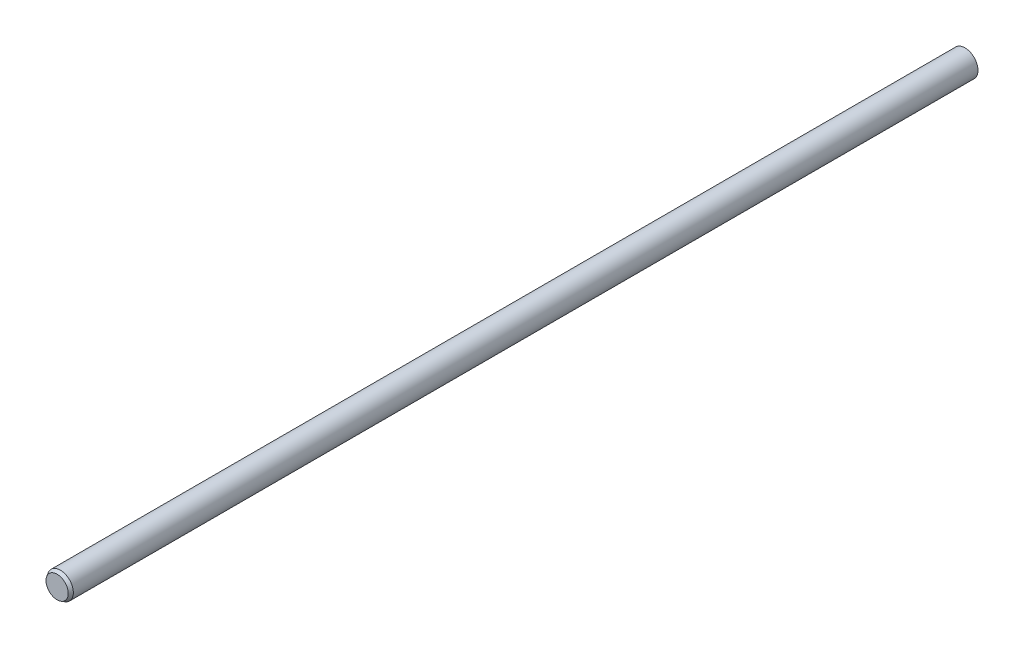
ISO-10303-21;
HEADER;
FILE_DESCRIPTION(('STEP AP214'),'2;1');
FILE_NAME('part.step','',(''),(''),'','','');
FILE_SCHEMA(('AUTOMOTIVE_DESIGN { 1 0 10303 214 1 1 1 1 }'));
ENDSEC;
DATA;
#1=APPLICATION_CONTEXT('core data for automotive mechanical design processes');
#2=APPLICATION_PROTOCOL_DEFINITION('international standard','automotive_design',2000,#1);
#3=PRODUCT_CONTEXT('',#1,'mechanical');
#4=PRODUCT('Part','Part','',(#3));
#5=PRODUCT_RELATED_PRODUCT_CATEGORY('part','',(#4));
#6=PRODUCT_DEFINITION_FORMATION('','',#4);
#7=PRODUCT_DEFINITION_CONTEXT('part definition',#1,'design');
#8=PRODUCT_DEFINITION('design','',#6,#7);
#9=PRODUCT_DEFINITION_SHAPE('','',#8);
#10=(LENGTH_UNIT() NAMED_UNIT(*) SI_UNIT(.MILLI.,.METRE.));
#11=(NAMED_UNIT(*) PLANE_ANGLE_UNIT() SI_UNIT($,.RADIAN.));
#12=(NAMED_UNIT(*) SI_UNIT($,.STERADIAN.) SOLID_ANGLE_UNIT());
#13=UNCERTAINTY_MEASURE_WITH_UNIT(LENGTH_MEASURE(1.E-05),#10,'distance_accuracy_value','');
#14=(GEOMETRIC_REPRESENTATION_CONTEXT(3) GLOBAL_UNCERTAINTY_ASSIGNED_CONTEXT((#13)) GLOBAL_UNIT_ASSIGNED_CONTEXT((#10,
#11,#12)) REPRESENTATION_CONTEXT('',''));
#15=CARTESIAN_POINT('',(0.,0.,0.));
#16=DIRECTION('',(0.,0.,1.));
#17=DIRECTION('',(1.,0.,0.));
#18=AXIS2_PLACEMENT_3D('',#15,#16,#17);
#19=CARTESIAN_POINT('',(0.,0.,280.));
#20=DIRECTION('',(0.,0.,-1.));
#21=DIRECTION('',(-1.,0.,0.));
#22=AXIS2_PLACEMENT_3D('',#19,#20,#21);
#23=CYLINDRICAL_SURFACE('',#22,4.);
#24=CARTESIAN_POINT('',(0.,0.,0.577350269189647));
#25=DIRECTION('',(0.,0.,1.));
#26=DIRECTION('',(1.,0.,0.));
#27=AXIS2_PLACEMENT_3D('',#24,#25,#26);
#28=CIRCLE('',#27,4.);
#29=CARTESIAN_POINT('',(4.,0.,0.577350269189647));
#30=VERTEX_POINT('',#29);
#31=EDGE_CURVE('E46',#30,#30,#28,.T.);
#32=ORIENTED_EDGE('',*,*,#31,.T.);
#33=EDGE_LOOP('',(#32));
#34=FACE_BOUND('',#33,.T.);
#35=CARTESIAN_POINT('',(0.,0.,279.));
#36=DIRECTION('',(0.,0.,1.));
#37=DIRECTION('',(1.,0.,0.));
#38=AXIS2_PLACEMENT_3D('',#35,#36,#37);
#39=CIRCLE('',#38,4.);
#40=CARTESIAN_POINT('',(4.,0.,279.));
#41=VERTEX_POINT('',#40);
#42=EDGE_CURVE('E50',#41,#41,#39,.F.);
#43=ORIENTED_EDGE('',*,*,#42,.T.);
#44=EDGE_LOOP('',(#43));
#45=FACE_BOUND('',#44,.T.);
#46=ADVANCED_FACE('F35',(#34,#45),#23,.T.);
#47=CARTESIAN_POINT('',(0.,0.,280.));
#48=DIRECTION('',(0.,0.,1.));
#49=DIRECTION('',(1.,0.,0.));
#50=AXIS2_PLACEMENT_3D('',#47,#48,#49);
#51=PLANE('',#50);
#52=CARTESIAN_POINT('',(0.,0.,280.));
#53=DIRECTION('',(0.,0.,1.));
#54=DIRECTION('',(1.,0.,0.));
#55=AXIS2_PLACEMENT_3D('',#52,#53,#54);
#56=CIRCLE('',#55,3.42264973081033);
#57=CARTESIAN_POINT('',(3.42264973081033,0.,280.));
#58=VERTEX_POINT('',#57);
#59=EDGE_CURVE('E10',#58,#58,#56,.T.);
#60=ORIENTED_EDGE('',*,*,#59,.T.);
#61=EDGE_LOOP('',(#60));
#62=FACE_BOUND('',#61,.T.);
#63=ADVANCED_FACE('F66',(#62),#51,.T.);
#64=CARTESIAN_POINT('',(0.,0.,0.));
#65=DIRECTION('',(0.,0.,1.));
#66=DIRECTION('',(1.,0.,0.));
#67=AXIS2_PLACEMENT_3D('',#64,#65,#66);
#68=PLANE('',#67);
#69=CARTESIAN_POINT('',(0.,0.,0.));
#70=DIRECTION('',(0.,0.,1.));
#71=DIRECTION('',(1.,0.,0.));
#72=AXIS2_PLACEMENT_3D('',#69,#70,#71);
#73=CIRCLE('',#72,2.99999999999998);
#74=CARTESIAN_POINT('',(2.99999999999998,0.,0.));
#75=VERTEX_POINT('',#74);
#76=EDGE_CURVE('E42',#75,#75,#73,.F.);
#77=ORIENTED_EDGE('',*,*,#76,.T.);
#78=EDGE_LOOP('',(#77));
#79=FACE_BOUND('',#78,.T.);
#80=ADVANCED_FACE('F63',(#79),#68,.F.);
#81=CARTESIAN_POINT('',(0.,0.,0.577350269189647));
#82=DIRECTION('',(0.,0.,1.));
#83=DIRECTION('',(1.,0.,0.));
#84=AXIS2_PLACEMENT_3D('',#81,#82,#83);
#85=CONICAL_SURFACE('',#84,4.,1.04719755119659);
#86=ORIENTED_EDGE('',*,*,#76,.F.);
#87=EDGE_LOOP('',(#86));
#88=FACE_BOUND('',#87,.T.);
#89=ORIENTED_EDGE('',*,*,#31,.F.);
#90=EDGE_LOOP('',(#89));
#91=FACE_BOUND('',#90,.T.);
#92=ADVANCED_FACE('F59',(#88,#91),#85,.T.);
#93=CARTESIAN_POINT('',(0.,0.,280.));
#94=DIRECTION('',(0.,0.,-1.));
#95=DIRECTION('',(-1.,0.,0.));
#96=AXIS2_PLACEMENT_3D('',#93,#94,#95);
#97=CONICAL_SURFACE('',#96,3.42264973081033,0.523598775598309);
#98=ORIENTED_EDGE('',*,*,#42,.F.);
#99=EDGE_LOOP('',(#98));
#100=FACE_BOUND('',#99,.T.);
#101=ORIENTED_EDGE('',*,*,#59,.F.);
#102=EDGE_LOOP('',(#101));
#103=FACE_BOUND('',#102,.T.);
#104=ADVANCED_FACE('F37',(#100,#103),#97,.T.);
#105=CLOSED_SHELL('',(#46,#63,#80,#92,#104));
#106=MANIFOLD_SOLID_BREP('B2',#105);
#107=ADVANCED_BREP_SHAPE_REPRESENTATION('',(#18,#106),#14);
#108=SHAPE_DEFINITION_REPRESENTATION(#9,#107);
ENDSEC;
END-ISO-10303-21;
